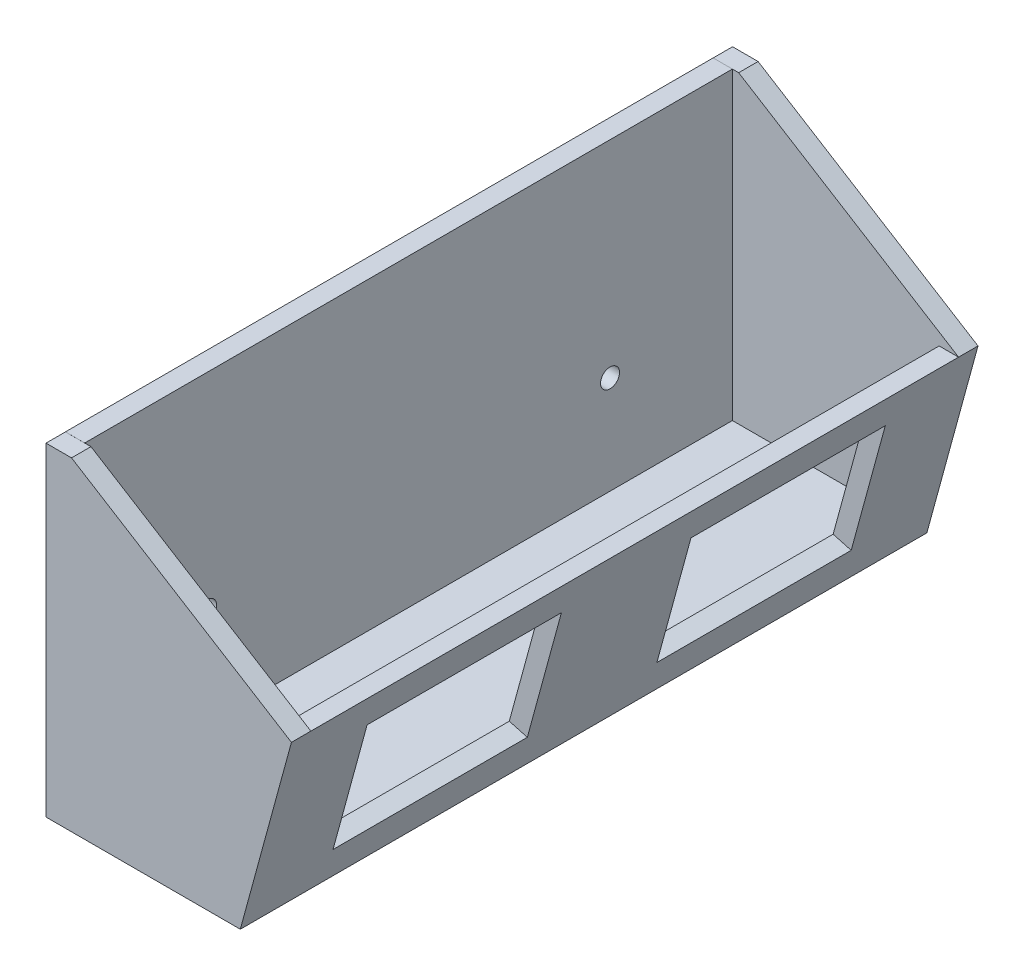
ISO-10303-21;
HEADER;
FILE_DESCRIPTION(('STEP AP214'),'2;1');
FILE_NAME('part.step','',(''),(''),'','','');
FILE_SCHEMA(('AUTOMOTIVE_DESIGN { 1 0 10303 214 1 1 1 1 }'));
ENDSEC;
DATA;
#1=APPLICATION_CONTEXT('core data for automotive mechanical design processes');
#2=APPLICATION_PROTOCOL_DEFINITION('international standard','automotive_design',2000,#1);
#3=PRODUCT_CONTEXT('',#1,'mechanical');
#4=PRODUCT('Part','Part','',(#3));
#5=PRODUCT_RELATED_PRODUCT_CATEGORY('part','',(#4));
#6=PRODUCT_DEFINITION_FORMATION('','',#4);
#7=PRODUCT_DEFINITION_CONTEXT('part definition',#1,'design');
#8=PRODUCT_DEFINITION('design','',#6,#7);
#9=PRODUCT_DEFINITION_SHAPE('','',#8);
#10=(LENGTH_UNIT() NAMED_UNIT(*) SI_UNIT(.MILLI.,.METRE.));
#11=(NAMED_UNIT(*) PLANE_ANGLE_UNIT() SI_UNIT($,.RADIAN.));
#12=(NAMED_UNIT(*) SI_UNIT($,.STERADIAN.) SOLID_ANGLE_UNIT());
#13=UNCERTAINTY_MEASURE_WITH_UNIT(LENGTH_MEASURE(1.E-05),#10,'distance_accuracy_value','');
#14=(GEOMETRIC_REPRESENTATION_CONTEXT(3) GLOBAL_UNCERTAINTY_ASSIGNED_CONTEXT((#13)) GLOBAL_UNIT_ASSIGNED_CONTEXT((#10,
#11,#12)) REPRESENTATION_CONTEXT('',''));
#15=CARTESIAN_POINT('',(0.,0.,0.));
#16=DIRECTION('',(0.,0.,1.));
#17=DIRECTION('',(1.,0.,0.));
#18=AXIS2_PLACEMENT_3D('',#15,#16,#17);
#19=CARTESIAN_POINT('',(37.8942985604375,28.9427028841239,3.));
#20=DIRECTION('',(-0.964756762804131,0.263143285347916,0.));
#21=DIRECTION('',(-0.263143285347916,-0.964756762804131,0.));
#22=AXIS2_PLACEMENT_3D('',#19,#20,#21);
#23=PLANE('',#22);
#24=DIRECTION('',(0.,0.,-1.));
#25=VECTOR('',#24,1.);
#26=CARTESIAN_POINT('',(37.8942985604375,28.9427028841239,3.));
#27=LINE('',#26,#25);
#28=CARTESIAN_POINT('',(37.8942985604375,28.9427028841239,103.));
#29=VERTEX_POINT('',#28);
#30=CARTESIAN_POINT('',(37.8942985604375,28.9427028841239,3.));
#31=VERTEX_POINT('',#30);
#32=EDGE_CURVE('E256',#29,#31,#27,.T.);
#33=ORIENTED_EDGE('',*,*,#32,.F.);
#34=DIRECTION('',(0.,0.,-1.));
#35=VECTOR('',#34,1.);
#36=CARTESIAN_POINT('',(37.8942985604375,28.9427028841239,106.));
#37=LINE('',#36,#35);
#38=CARTESIAN_POINT('',(37.8942985604375,28.9427028841239,106.));
#39=VERTEX_POINT('',#38);
#40=EDGE_CURVE('E311',#39,#29,#37,.T.);
#41=ORIENTED_EDGE('',*,*,#40,.F.);
#42=DIRECTION('',(0.263143285347916,0.964756762804131,0.));
#43=VECTOR('',#42,1.);
#44=CARTESIAN_POINT('',(37.8942985604375,28.9427028841239,106.));
#45=LINE('',#44,#43);
#46=CARTESIAN_POINT('',(30.,0.,106.));
#47=VERTEX_POINT('',#46);
#48=EDGE_CURVE('E291',#47,#39,#45,.T.);
#49=ORIENTED_EDGE('',*,*,#48,.F.);
#50=DIRECTION('',(0.,0.,-1.));
#51=VECTOR('',#50,1.);
#52=CARTESIAN_POINT('',(30.,0.,3.));
#53=LINE('',#52,#51);
#54=CARTESIAN_POINT('',(30.,0.,0.));
#55=VERTEX_POINT('',#54);
#56=EDGE_CURVE('E41',#47,#55,#53,.T.);
#57=ORIENTED_EDGE('',*,*,#56,.T.);
#58=DIRECTION('',(0.263143285347916,0.964756762804131,0.));
#59=VECTOR('',#58,1.);
#60=CARTESIAN_POINT('',(37.8942985604375,28.9427028841239,0.));
#61=LINE('',#60,#59);
#62=CARTESIAN_POINT('',(37.8942985604375,28.9427028841239,0.));
#63=VERTEX_POINT('',#62);
#64=EDGE_CURVE('E327',#55,#63,#61,.T.);
#65=ORIENTED_EDGE('',*,*,#64,.T.);
#66=DIRECTION('',(0.,0.,-1.));
#67=VECTOR('',#66,1.);
#68=CARTESIAN_POINT('',(37.8942985604375,28.9427028841239,3.));
#69=LINE('',#68,#67);
#70=EDGE_CURVE('E342',#31,#63,#69,.T.);
#71=ORIENTED_EDGE('',*,*,#70,.F.);
#72=EDGE_LOOP('',(#33,#41,#49,#57,#65,#71));
#73=FACE_BOUND('',#72,.T.);
#74=DIRECTION('',(0.263143285347916,0.964756762804131,0.));
#75=VECTOR('',#74,1.);
#76=CARTESIAN_POINT('',(36.5785821336979,24.1189190701033,63.));
#77=LINE('',#76,#75);
#78=CARTESIAN_POINT('',(31.3157164267396,4.82378381402067,63.));
#79=VERTEX_POINT('',#78);
#80=CARTESIAN_POINT('',(36.5785821336979,24.1189190701033,63.));
#81=VERTEX_POINT('',#80);
#82=EDGE_CURVE('E217',#79,#81,#77,.T.);
#83=ORIENTED_EDGE('',*,*,#82,.F.);
#84=DIRECTION('',(0.,0.,-1.));
#85=VECTOR('',#84,1.);
#86=CARTESIAN_POINT('',(31.3157164267396,4.82378381402066,93.));
#87=LINE('',#86,#85);
#88=CARTESIAN_POINT('',(31.3157164267396,4.82378381402066,93.));
#89=VERTEX_POINT('',#88);
#90=EDGE_CURVE('E220',#89,#79,#87,.T.);
#91=ORIENTED_EDGE('',*,*,#90,.F.);
#92=DIRECTION('',(-0.263143285347916,-0.96475676280413,0.));
#93=VECTOR('',#92,1.);
#94=CARTESIAN_POINT('',(36.5785821336979,24.1189190701033,93.));
#95=LINE('',#94,#93);
#96=CARTESIAN_POINT('',(36.5785821336979,24.1189190701033,93.));
#97=VERTEX_POINT('',#96);
#98=EDGE_CURVE('E210',#97,#89,#95,.T.);
#99=ORIENTED_EDGE('',*,*,#98,.F.);
#100=DIRECTION('',(0.,0.,1.));
#101=VECTOR('',#100,1.);
#102=CARTESIAN_POINT('',(36.5785821336979,24.1189190701033,93.));
#103=LINE('',#102,#101);
#104=EDGE_CURVE('E215',#81,#97,#103,.T.);
#105=ORIENTED_EDGE('',*,*,#104,.F.);
#106=EDGE_LOOP('',(#83,#91,#99,#105));
#107=FACE_BOUND('',#106,.T.);
#108=DIRECTION('',(0.,0.,-1.));
#109=VECTOR('',#108,1.);
#110=CARTESIAN_POINT('',(36.5785821336979,24.1189190701033,13.));
#111=LINE('',#110,#109);
#112=CARTESIAN_POINT('',(36.5785821336979,24.1189190701033,43.));
#113=VERTEX_POINT('',#112);
#114=CARTESIAN_POINT('',(36.5785821336979,24.1189190701033,13.));
#115=VERTEX_POINT('',#114);
#116=EDGE_CURVE('E184',#113,#115,#111,.T.);
#117=ORIENTED_EDGE('',*,*,#116,.T.);
#118=DIRECTION('',(-0.263143285347916,-0.96475676280413,0.));
#119=VECTOR('',#118,1.);
#120=CARTESIAN_POINT('',(36.5785821336979,24.1189190701033,13.));
#121=LINE('',#120,#119);
#122=CARTESIAN_POINT('',(31.3157164267396,4.8237838140207,13.));
#123=VERTEX_POINT('',#122);
#124=EDGE_CURVE('E192',#115,#123,#121,.T.);
#125=ORIENTED_EDGE('',*,*,#124,.T.);
#126=DIRECTION('',(0.,0.,1.));
#127=VECTOR('',#126,1.);
#128=CARTESIAN_POINT('',(31.3157164267396,4.8237838140207,13.));
#129=LINE('',#128,#127);
#130=CARTESIAN_POINT('',(31.3157164267396,4.82378381402068,43.));
#131=VERTEX_POINT('',#130);
#132=EDGE_CURVE('E48',#123,#131,#129,.T.);
#133=ORIENTED_EDGE('',*,*,#132,.T.);
#134=DIRECTION('',(0.263143285347916,0.964756762804131,0.));
#135=VECTOR('',#134,1.);
#136=CARTESIAN_POINT('',(36.5785821336979,24.1189190701033,43.));
#137=LINE('',#136,#135);
#138=EDGE_CURVE('E199',#131,#113,#137,.T.);
#139=ORIENTED_EDGE('',*,*,#138,.T.);
#140=EDGE_LOOP('',(#117,#125,#133,#139));
#141=FACE_BOUND('',#140,.T.);
#142=ADVANCED_FACE('F33',(#73,#107,#141),#23,.F.);
#143=CARTESIAN_POINT('',(27.8242856541056,3.0061175714593,3.));
#144=DIRECTION('',(-0.964756762804131,0.263143285347916,0.));
#145=DIRECTION('',(-0.263143285347916,-0.964756762804131,0.));
#146=AXIS2_PLACEMENT_3D('',#143,#144,#145);
#147=PLANE('',#146);
#148=DIRECTION('',(0.,0.,-1.));
#149=VECTOR('',#148,1.);
#150=CARTESIAN_POINT('',(28.5274972348041,5.58428758732769,93.));
#151=LINE('',#150,#149);
#152=CARTESIAN_POINT('',(28.5274972348041,5.5842875873277,93.));
#153=VERTEX_POINT('',#152);
#154=CARTESIAN_POINT('',(28.5274972348041,5.5842875873277,63.));
#155=VERTEX_POINT('',#154);
#156=EDGE_CURVE('E211',#153,#155,#151,.T.);
#157=ORIENTED_EDGE('',*,*,#156,.T.);
#158=DIRECTION('',(0.263143285347916,0.964756762804131,0.));
#159=VECTOR('',#158,1.);
#160=CARTESIAN_POINT('',(33.7903629417624,24.8794228434103,63.));
#161=LINE('',#160,#159);
#162=CARTESIAN_POINT('',(33.7903629417624,24.8794228434103,63.));
#163=VERTEX_POINT('',#162);
#164=EDGE_CURVE('E234',#155,#163,#161,.T.);
#165=ORIENTED_EDGE('',*,*,#164,.T.);
#166=DIRECTION('',(0.,0.,1.));
#167=VECTOR('',#166,1.);
#168=CARTESIAN_POINT('',(33.7903629417624,24.8794228434103,93.));
#169=LINE('',#168,#167);
#170=CARTESIAN_POINT('',(33.7903629417624,24.8794228434103,93.));
#171=VERTEX_POINT('',#170);
#172=EDGE_CURVE('E230',#163,#171,#169,.T.);
#173=ORIENTED_EDGE('',*,*,#172,.T.);
#174=DIRECTION('',(-0.263143285347916,-0.964756762804131,0.));
#175=VECTOR('',#174,1.);
#176=CARTESIAN_POINT('',(33.7903629417624,24.8794228434103,93.));
#177=LINE('',#176,#175);
#178=EDGE_CURVE('E225',#171,#153,#177,.T.);
#179=ORIENTED_EDGE('',*,*,#178,.T.);
#180=EDGE_LOOP('',(#157,#165,#173,#179));
#181=FACE_BOUND('',#180,.T.);
#182=DIRECTION('',(0.263143285347916,0.964756762804131,0.));
#183=VECTOR('',#182,1.);
#184=CARTESIAN_POINT('',(27.8242856541056,3.0061175714593,103.));
#185=LINE('',#184,#183);
#186=CARTESIAN_POINT('',(27.8242856541056,3.0061175714593,103.));
#187=VERTEX_POINT('',#186);
#188=CARTESIAN_POINT('',(34.8986473305592,28.9427028841239,103.));
#189=VERTEX_POINT('',#188);
#190=EDGE_CURVE('E249',#187,#189,#185,.T.);
#191=ORIENTED_EDGE('',*,*,#190,.T.);
#192=DIRECTION('',(0.,0.,1.));
#193=VECTOR('',#192,1.);
#194=CARTESIAN_POINT('',(34.8986473305592,28.9427028841239,3.));
#195=LINE('',#194,#193);
#196=CARTESIAN_POINT('',(34.8986473305592,28.9427028841239,3.));
#197=VERTEX_POINT('',#196);
#198=EDGE_CURVE('E246',#197,#189,#195,.T.);
#199=ORIENTED_EDGE('',*,*,#198,.F.);
#200=DIRECTION('',(0.263143285347916,0.964756762804131,0.));
#201=VECTOR('',#200,1.);
#202=CARTESIAN_POINT('',(27.8242856541056,3.0061175714593,3.));
#203=LINE('',#202,#201);
#204=CARTESIAN_POINT('',(27.8242856541055,3.0061175714593,3.));
#205=VERTEX_POINT('',#204);
#206=EDGE_CURVE('E245',#205,#197,#203,.T.);
#207=ORIENTED_EDGE('',*,*,#206,.F.);
#208=DIRECTION('',(0.,0.,1.));
#209=VECTOR('',#208,1.);
#210=CARTESIAN_POINT('',(27.8242856541056,3.0061175714593,3.));
#211=LINE('',#210,#209);
#212=EDGE_CURVE('E242',#205,#187,#211,.T.);
#213=ORIENTED_EDGE('',*,*,#212,.T.);
#214=EDGE_LOOP('',(#191,#199,#207,#213));
#215=FACE_BOUND('',#214,.T.);
#216=DIRECTION('',(-0.263143285347916,-0.964756762804131,0.));
#217=VECTOR('',#216,1.);
#218=CARTESIAN_POINT('',(33.7903629417624,24.8794228434103,13.));
#219=LINE('',#218,#217);
#220=CARTESIAN_POINT('',(33.7903629417624,24.8794228434103,13.));
#221=VERTEX_POINT('',#220);
#222=CARTESIAN_POINT('',(28.5274972348041,5.58428758732773,13.));
#223=VERTEX_POINT('',#222);
#224=EDGE_CURVE('E196',#221,#223,#219,.T.);
#225=ORIENTED_EDGE('',*,*,#224,.F.);
#226=DIRECTION('',(0.,0.,-1.));
#227=VECTOR('',#226,1.);
#228=CARTESIAN_POINT('',(33.7903629417624,24.8794228434103,13.));
#229=LINE('',#228,#227);
#230=CARTESIAN_POINT('',(33.7903629417624,24.8794228434103,43.));
#231=VERTEX_POINT('',#230);
#232=EDGE_CURVE('E56',#231,#221,#229,.T.);
#233=ORIENTED_EDGE('',*,*,#232,.F.);
#234=DIRECTION('',(0.263143285347916,0.964756762804131,0.));
#235=VECTOR('',#234,1.);
#236=CARTESIAN_POINT('',(33.7903629417624,24.8794228434103,43.));
#237=LINE('',#236,#235);
#238=CARTESIAN_POINT('',(28.5274972348041,5.58428758732771,43.));
#239=VERTEX_POINT('',#238);
#240=EDGE_CURVE('E419',#239,#231,#237,.T.);
#241=ORIENTED_EDGE('',*,*,#240,.F.);
#242=DIRECTION('',(0.,0.,1.));
#243=VECTOR('',#242,1.);
#244=CARTESIAN_POINT('',(28.5274972348041,5.58428758732773,13.));
#245=LINE('',#244,#243);
#246=EDGE_CURVE('E418',#223,#239,#245,.T.);
#247=ORIENTED_EDGE('',*,*,#246,.F.);
#248=EDGE_LOOP('',(#225,#233,#241,#247));
#249=FACE_BOUND('',#248,.T.);
#250=ADVANCED_FACE('F410',(#181,#215,#249),#147,.T.);
#251=CARTESIAN_POINT('',(0.,0.,3.));
#252=DIRECTION('',(0.,0.,-1.));
#253=DIRECTION('',(-1.,0.,0.));
#254=AXIS2_PLACEMENT_3D('',#251,#252,#253);
#255=PLANE('',#254);
#256=DIRECTION('',(-1.,0.,0.));
#257=VECTOR('',#256,1.);
#258=CARTESIAN_POINT('',(37.8942985604375,28.9427028841239,3.));
#259=LINE('',#258,#257);
#260=EDGE_CURVE('E259',#31,#197,#259,.T.);
#261=ORIENTED_EDGE('',*,*,#260,.F.);
#262=DIRECTION('',(-0.849820074148082,0.527072899677974,0.));
#263=VECTOR('',#262,1.);
#264=CARTESIAN_POINT('',(3.94280189402707,50.,3.));
#265=LINE('',#264,#263);
#266=CARTESIAN_POINT('',(3.94280189402707,50.,3.));
#267=VERTEX_POINT('',#266);
#268=EDGE_CURVE('E318',#31,#267,#265,.T.);
#269=ORIENTED_EDGE('',*,*,#268,.T.);
#270=DIRECTION('',(-1.,0.,0.));
#271=VECTOR('',#270,1.);
#272=CARTESIAN_POINT('',(0.,50.,3.));
#273=LINE('',#272,#271);
#274=CARTESIAN_POINT('',(2.97567344961181,50.,3.));
#275=VERTEX_POINT('',#274);
#276=EDGE_CURVE('E320',#267,#275,#273,.T.);
#277=ORIENTED_EDGE('',*,*,#276,.T.);
#278=DIRECTION('',(0.,-1.,0.));
#279=VECTOR('',#278,1.);
#280=CARTESIAN_POINT('',(2.97567344961181,50.0061175714593,3.));
#281=LINE('',#280,#279);
#282=CARTESIAN_POINT('',(2.97567344961181,3.0061175714593,3.));
#283=VERTEX_POINT('',#282);
#284=EDGE_CURVE('E277',#275,#283,#281,.T.);
#285=ORIENTED_EDGE('',*,*,#284,.T.);
#286=DIRECTION('',(-1.,0.,0.));
#287=VECTOR('',#286,1.);
#288=CARTESIAN_POINT('',(0.,3.0061175714593,3.));
#289=LINE('',#288,#287);
#290=EDGE_CURVE('E313',#205,#283,#289,.T.);
#291=ORIENTED_EDGE('',*,*,#290,.F.);
#292=ORIENTED_EDGE('',*,*,#206,.T.);
#293=EDGE_LOOP('',(#261,#269,#277,#285,#291,#292));
#294=FACE_BOUND('',#293,.T.);
#295=ADVANCED_FACE('F370',(#294),#255,.F.);
#296=CARTESIAN_POINT('',(0.,3.0061175714593,103.));
#297=DIRECTION('',(0.,-1.,0.));
#298=DIRECTION('',(0.,0.,-1.));
#299=AXIS2_PLACEMENT_3D('',#296,#297,#298);
#300=PLANE('',#299);
#301=ORIENTED_EDGE('',*,*,#212,.F.);
#302=ORIENTED_EDGE('',*,*,#290,.T.);
#303=DIRECTION('',(0.,0.,-1.));
#304=VECTOR('',#303,1.);
#305=CARTESIAN_POINT('',(2.97567344961181,3.0061175714593,3.));
#306=LINE('',#305,#304);
#307=CARTESIAN_POINT('',(2.97567344961181,3.0061175714593,103.));
#308=VERTEX_POINT('',#307);
#309=EDGE_CURVE('E262',#308,#283,#306,.T.);
#310=ORIENTED_EDGE('',*,*,#309,.F.);
#311=DIRECTION('',(-1.,0.,0.));
#312=VECTOR('',#311,1.);
#313=CARTESIAN_POINT('',(0.,3.0061175714593,103.));
#314=LINE('',#313,#312);
#315=EDGE_CURVE('E314',#187,#308,#314,.T.);
#316=ORIENTED_EDGE('',*,*,#315,.F.);
#317=EDGE_LOOP('',(#301,#302,#310,#316));
#318=FACE_BOUND('',#317,.T.);
#319=ADVANCED_FACE('F407',(#318),#300,.F.);
#320=CARTESIAN_POINT('',(0.,0.,103.));
#321=DIRECTION('',(0.,0.,-1.));
#322=DIRECTION('',(-1.,0.,0.));
#323=AXIS2_PLACEMENT_3D('',#320,#321,#322);
#324=PLANE('',#323);
#325=DIRECTION('',(1.,0.,0.));
#326=VECTOR('',#325,1.);
#327=CARTESIAN_POINT('',(37.8942985604375,28.9427028841239,103.));
#328=LINE('',#327,#326);
#329=EDGE_CURVE('E252',#189,#29,#328,.T.);
#330=ORIENTED_EDGE('',*,*,#329,.F.);
#331=ORIENTED_EDGE('',*,*,#190,.F.);
#332=ORIENTED_EDGE('',*,*,#315,.T.);
#333=DIRECTION('',(0.,1.,0.));
#334=VECTOR('',#333,1.);
#335=CARTESIAN_POINT('',(2.97567344961181,0.,103.));
#336=LINE('',#335,#334);
#337=CARTESIAN_POINT('',(2.97567344961181,50.,103.));
#338=VERTEX_POINT('',#337);
#339=EDGE_CURVE('E11',#308,#338,#336,.T.);
#340=ORIENTED_EDGE('',*,*,#339,.T.);
#341=DIRECTION('',(-1.,0.,0.));
#342=VECTOR('',#341,1.);
#343=CARTESIAN_POINT('',(0.,50.,103.));
#344=LINE('',#343,#342);
#345=CARTESIAN_POINT('',(3.94280189402707,50.,103.));
#346=VERTEX_POINT('',#345);
#347=EDGE_CURVE('E292',#346,#338,#344,.T.);
#348=ORIENTED_EDGE('',*,*,#347,.F.);
#349=DIRECTION('',(-0.849820074148082,0.527072899677974,0.));
#350=VECTOR('',#349,1.);
#351=CARTESIAN_POINT('',(3.94280189402707,50.,103.));
#352=LINE('',#351,#350);
#353=EDGE_CURVE('E287',#29,#346,#352,.T.);
#354=ORIENTED_EDGE('',*,*,#353,.F.);
#355=EDGE_LOOP('',(#330,#331,#332,#340,#348,#354));
#356=FACE_BOUND('',#355,.T.);
#357=ADVANCED_FACE('F378',(#356),#324,.T.);
#358=CARTESIAN_POINT('',(30.,0.,3.));
#359=DIRECTION('',(0.,1.,0.));
#360=DIRECTION('',(-1.,0.,0.));
#361=AXIS2_PLACEMENT_3D('',#358,#359,#360);
#362=PLANE('',#361);
#363=DIRECTION('',(1.,0.,0.));
#364=VECTOR('',#363,1.);
#365=CARTESIAN_POINT('',(30.,0.,0.));
#366=LINE('',#365,#364);
#367=CARTESIAN_POINT('',(0.,0.,0.));
#368=VERTEX_POINT('',#367);
#369=EDGE_CURVE('E316',#368,#55,#366,.T.);
#370=ORIENTED_EDGE('',*,*,#369,.T.);
#371=ORIENTED_EDGE('',*,*,#56,.F.);
#372=DIRECTION('',(1.,0.,0.));
#373=VECTOR('',#372,1.);
#374=CARTESIAN_POINT('',(30.,0.,106.));
#375=LINE('',#374,#373);
#376=CARTESIAN_POINT('',(0.,0.,106.));
#377=VERTEX_POINT('',#376);
#378=EDGE_CURVE('E288',#377,#47,#375,.T.);
#379=ORIENTED_EDGE('',*,*,#378,.F.);
#380=DIRECTION('',(0.,0.,-1.));
#381=VECTOR('',#380,1.);
#382=CARTESIAN_POINT('',(0.,0.,3.));
#383=LINE('',#382,#381);
#384=EDGE_CURVE('E324',#377,#368,#383,.T.);
#385=ORIENTED_EDGE('',*,*,#384,.T.);
#386=EDGE_LOOP('',(#370,#371,#379,#385));
#387=FACE_BOUND('',#386,.T.);
#388=ADVANCED_FACE('F35',(#387),#362,.F.);
#389=CARTESIAN_POINT('',(3.94280189402707,50.,3.));
#390=DIRECTION('',(-0.527072899677974,-0.849820074148082,0.));
#391=DIRECTION('',(0.849820074148082,-0.527072899677974,0.));
#392=AXIS2_PLACEMENT_3D('',#389,#390,#391);
#393=PLANE('',#392);
#394=DIRECTION('',(-0.849820074148082,0.527072899677974,0.));
#395=VECTOR('',#394,1.);
#396=CARTESIAN_POINT('',(3.94280189402707,50.,0.));
#397=LINE('',#396,#395);
#398=CARTESIAN_POINT('',(3.94280189402707,50.,0.));
#399=VERTEX_POINT('',#398);
#400=EDGE_CURVE('E329',#63,#399,#397,.T.);
#401=ORIENTED_EDGE('',*,*,#400,.T.);
#402=DIRECTION('',(0.,0.,-1.));
#403=VECTOR('',#402,1.);
#404=CARTESIAN_POINT('',(3.94280189402707,50.,3.));
#405=LINE('',#404,#403);
#406=EDGE_CURVE('E339',#267,#399,#405,.T.);
#407=ORIENTED_EDGE('',*,*,#406,.F.);
#408=ORIENTED_EDGE('',*,*,#268,.F.);
#409=ORIENTED_EDGE('',*,*,#70,.T.);
#410=EDGE_LOOP('',(#401,#407,#408,#409));
#411=FACE_BOUND('',#410,.T.);
#412=ADVANCED_FACE('F361',(#411),#393,.F.);
#413=CARTESIAN_POINT('',(0.,50.,3.));
#414=DIRECTION('',(0.,-1.,0.));
#415=DIRECTION('',(0.,0.,-1.));
#416=AXIS2_PLACEMENT_3D('',#413,#414,#415);
#417=PLANE('',#416);
#418=DIRECTION('',(-1.,0.,0.));
#419=VECTOR('',#418,1.);
#420=CARTESIAN_POINT('',(0.,50.,0.));
#421=LINE('',#420,#419);
#422=CARTESIAN_POINT('',(0.,50.,0.));
#423=VERTEX_POINT('',#422);
#424=EDGE_CURVE('E331',#399,#423,#421,.T.);
#425=ORIENTED_EDGE('',*,*,#424,.T.);
#426=DIRECTION('',(0.,0.,-1.));
#427=VECTOR('',#426,1.);
#428=CARTESIAN_POINT('',(0.,50.,3.));
#429=LINE('',#428,#427);
#430=CARTESIAN_POINT('',(0.,50.,3.));
#431=VERTEX_POINT('',#430);
#432=EDGE_CURVE('E336',#431,#423,#429,.T.);
#433=ORIENTED_EDGE('',*,*,#432,.F.);
#434=DIRECTION('',(-1.,0.,0.));
#435=VECTOR('',#434,1.);
#436=CARTESIAN_POINT('',(0.,50.,3.));
#437=LINE('',#436,#435);
#438=EDGE_CURVE('E285',#275,#431,#437,.T.);
#439=ORIENTED_EDGE('',*,*,#438,.F.);
#440=ORIENTED_EDGE('',*,*,#276,.F.);
#441=ORIENTED_EDGE('',*,*,#406,.T.);
#442=EDGE_LOOP('',(#425,#433,#439,#440,#441));
#443=FACE_BOUND('',#442,.T.);
#444=ADVANCED_FACE('F364',(#443),#417,.F.);
#445=CARTESIAN_POINT('',(0.,0.,3.));
#446=DIRECTION('',(1.,0.,0.));
#447=DIRECTION('',(0.,0.,-1.));
#448=AXIS2_PLACEMENT_3D('',#445,#446,#447);
#449=PLANE('',#448);
#450=CARTESIAN_POINT('',(0.,18.1575227187052,21.8920936392763));
#451=DIRECTION('',(1.,0.,0.));
#452=DIRECTION('',(0.,0.,-1.));
#453=AXIS2_PLACEMENT_3D('',#450,#451,#452);
#454=CIRCLE('',#453,1.46214160124625);
#455=CARTESIAN_POINT('',(0.,18.1575227187052,20.42995203803));
#456=VERTEX_POINT('',#455);
#457=EDGE_CURVE('E430',#456,#456,#454,.F.);
#458=ORIENTED_EDGE('',*,*,#457,.F.);
#459=EDGE_LOOP('',(#458));
#460=FACE_BOUND('',#459,.T.);
#461=CARTESIAN_POINT('',(0.,18.1575227187052,84.1079063607237));
#462=DIRECTION('',(1.,0.,0.));
#463=DIRECTION('',(0.,0.,-1.));
#464=AXIS2_PLACEMENT_3D('',#461,#462,#463);
#465=CIRCLE('',#464,1.46214160124625);
#466=CARTESIAN_POINT('',(0.,18.1575227187052,82.6457647594775));
#467=VERTEX_POINT('',#466);
#468=EDGE_CURVE('E424',#467,#467,#465,.T.);
#469=ORIENTED_EDGE('',*,*,#468,.T.);
#470=EDGE_LOOP('',(#469));
#471=FACE_BOUND('',#470,.T.);
#472=DIRECTION('',(0.,-1.,0.));
#473=VECTOR('',#472,1.);
#474=CARTESIAN_POINT('',(0.,50.0061175714593,3.));
#475=LINE('',#474,#473);
#476=CARTESIAN_POINT('',(0.,50.0061175714593,3.));
#477=VERTEX_POINT('',#476);
#478=EDGE_CURVE('E272',#477,#431,#475,.T.);
#479=ORIENTED_EDGE('',*,*,#478,.T.);
#480=ORIENTED_EDGE('',*,*,#432,.T.);
#481=DIRECTION('',(0.,-1.,0.));
#482=VECTOR('',#481,1.);
#483=CARTESIAN_POINT('',(0.,0.,0.));
#484=LINE('',#483,#482);
#485=EDGE_CURVE('E321',#423,#368,#484,.T.);
#486=ORIENTED_EDGE('',*,*,#485,.T.);
#487=ORIENTED_EDGE('',*,*,#384,.F.);
#488=DIRECTION('',(0.,-1.,0.));
#489=VECTOR('',#488,1.);
#490=CARTESIAN_POINT('',(0.,0.,106.));
#491=LINE('',#490,#489);
#492=CARTESIAN_POINT('',(0.,50.,106.));
#493=VERTEX_POINT('',#492);
#494=EDGE_CURVE('E298',#493,#377,#491,.T.);
#495=ORIENTED_EDGE('',*,*,#494,.F.);
#496=DIRECTION('',(0.,0.,-1.));
#497=VECTOR('',#496,1.);
#498=CARTESIAN_POINT('',(0.,50.,106.));
#499=LINE('',#498,#497);
#500=CARTESIAN_POINT('',(0.,50.,103.));
#501=VERTEX_POINT('',#500);
#502=EDGE_CURVE('E301',#493,#501,#499,.T.);
#503=ORIENTED_EDGE('',*,*,#502,.T.);
#504=DIRECTION('',(0.,-1.,0.));
#505=VECTOR('',#504,1.);
#506=CARTESIAN_POINT('',(0.,50.0061175714593,103.));
#507=LINE('',#506,#505);
#508=CARTESIAN_POINT('',(0.,50.0061175714593,103.));
#509=VERTEX_POINT('',#508);
#510=EDGE_CURVE('E283',#509,#501,#507,.T.);
#511=ORIENTED_EDGE('',*,*,#510,.F.);
#512=DIRECTION('',(0.,0.,1.));
#513=VECTOR('',#512,1.);
#514=CARTESIAN_POINT('',(0.,50.0061175714593,3.));
#515=LINE('',#514,#513);
#516=EDGE_CURVE('E263',#477,#509,#515,.T.);
#517=ORIENTED_EDGE('',*,*,#516,.F.);
#518=EDGE_LOOP('',(#479,#480,#486,#487,#495,#503,#511,#517));
#519=FACE_BOUND('',#518,.T.);
#520=ADVANCED_FACE('F393',(#460,#471,#519),#449,.F.);
#521=CARTESIAN_POINT('',(0.,0.,0.));
#522=DIRECTION('',(0.,0.,-1.));
#523=DIRECTION('',(-1.,0.,0.));
#524=AXIS2_PLACEMENT_3D('',#521,#522,#523);
#525=PLANE('',#524);
#526=ORIENTED_EDGE('',*,*,#369,.F.);
#527=ORIENTED_EDGE('',*,*,#485,.F.);
#528=ORIENTED_EDGE('',*,*,#424,.F.);
#529=ORIENTED_EDGE('',*,*,#400,.F.);
#530=ORIENTED_EDGE('',*,*,#64,.F.);
#531=EDGE_LOOP('',(#526,#527,#528,#529,#530));
#532=FACE_BOUND('',#531,.T.);
#533=ADVANCED_FACE('F356',(#532),#525,.T.);
#534=CARTESIAN_POINT('',(3.94280189402707,50.,106.));
#535=DIRECTION('',(-0.527072899677974,-0.849820074148082,0.));
#536=DIRECTION('',(0.849820074148082,-0.527072899677974,0.));
#537=AXIS2_PLACEMENT_3D('',#534,#535,#536);
#538=PLANE('',#537);
#539=ORIENTED_EDGE('',*,*,#353,.T.);
#540=DIRECTION('',(0.,0.,-1.));
#541=VECTOR('',#540,1.);
#542=CARTESIAN_POINT('',(3.94280189402707,50.,106.));
#543=LINE('',#542,#541);
#544=CARTESIAN_POINT('',(3.94280189402707,50.,106.));
#545=VERTEX_POINT('',#544);
#546=EDGE_CURVE('E308',#545,#346,#543,.T.);
#547=ORIENTED_EDGE('',*,*,#546,.F.);
#548=DIRECTION('',(-0.849820074148082,0.527072899677974,0.));
#549=VECTOR('',#548,1.);
#550=CARTESIAN_POINT('',(3.94280189402707,50.,106.));
#551=LINE('',#550,#549);
#552=EDGE_CURVE('E294',#39,#545,#551,.T.);
#553=ORIENTED_EDGE('',*,*,#552,.F.);
#554=ORIENTED_EDGE('',*,*,#40,.T.);
#555=EDGE_LOOP('',(#539,#547,#553,#554));
#556=FACE_BOUND('',#555,.T.);
#557=ADVANCED_FACE('F383',(#556),#538,.F.);
#558=CARTESIAN_POINT('',(0.,50.,106.));
#559=DIRECTION('',(0.,-1.,0.));
#560=DIRECTION('',(0.,0.,-1.));
#561=AXIS2_PLACEMENT_3D('',#558,#559,#560);
#562=PLANE('',#561);
#563=ORIENTED_EDGE('',*,*,#347,.T.);
#564=EDGE_CURVE('E303',#338,#501,#344,.T.);
#565=ORIENTED_EDGE('',*,*,#564,.T.);
#566=ORIENTED_EDGE('',*,*,#502,.F.);
#567=DIRECTION('',(-1.,0.,0.));
#568=VECTOR('',#567,1.);
#569=CARTESIAN_POINT('',(0.,50.,106.));
#570=LINE('',#569,#568);
#571=EDGE_CURVE('E296',#545,#493,#570,.T.);
#572=ORIENTED_EDGE('',*,*,#571,.F.);
#573=ORIENTED_EDGE('',*,*,#546,.T.);
#574=EDGE_LOOP('',(#563,#565,#566,#572,#573));
#575=FACE_BOUND('',#574,.T.);
#576=ADVANCED_FACE('F386',(#575),#562,.F.);
#577=CARTESIAN_POINT('',(0.,0.,106.));
#578=DIRECTION('',(0.,0.,-1.));
#579=DIRECTION('',(-1.,0.,0.));
#580=AXIS2_PLACEMENT_3D('',#577,#578,#579);
#581=PLANE('',#580);
#582=ORIENTED_EDGE('',*,*,#378,.T.);
#583=ORIENTED_EDGE('',*,*,#48,.T.);
#584=ORIENTED_EDGE('',*,*,#552,.T.);
#585=ORIENTED_EDGE('',*,*,#571,.T.);
#586=ORIENTED_EDGE('',*,*,#494,.T.);
#587=EDGE_LOOP('',(#582,#583,#584,#585,#586));
#588=FACE_BOUND('',#587,.T.);
#589=ADVANCED_FACE('F391',(#588),#581,.F.);
#590=CARTESIAN_POINT('',(0.,50.0061175714593,3.));
#591=DIRECTION('',(0.,0.,1.));
#592=DIRECTION('',(1.,0.,0.));
#593=AXIS2_PLACEMENT_3D('',#590,#591,#592);
#594=PLANE('',#593);
#595=CARTESIAN_POINT('',(2.97567344961181,50.0061175714593,3.));
#596=VERTEX_POINT('',#595);
#597=EDGE_CURVE('E278',#596,#275,#281,.T.);
#598=ORIENTED_EDGE('',*,*,#597,.T.);
#599=ORIENTED_EDGE('',*,*,#438,.T.);
#600=ORIENTED_EDGE('',*,*,#478,.F.);
#601=DIRECTION('',(-1.,0.,0.));
#602=VECTOR('',#601,1.);
#603=CARTESIAN_POINT('',(0.,50.0061175714593,3.));
#604=LINE('',#603,#602);
#605=EDGE_CURVE('E270',#596,#477,#604,.T.);
#606=ORIENTED_EDGE('',*,*,#605,.F.);
#607=EDGE_LOOP('',(#598,#599,#600,#606));
#608=FACE_BOUND('',#607,.T.);
#609=ADVANCED_FACE('F399',(#608),#594,.F.);
#610=CARTESIAN_POINT('',(0.,50.0061175714593,103.));
#611=DIRECTION('',(0.,0.,-1.));
#612=DIRECTION('',(-1.,0.,0.));
#613=AXIS2_PLACEMENT_3D('',#610,#611,#612);
#614=PLANE('',#613);
#615=ORIENTED_EDGE('',*,*,#510,.T.);
#616=ORIENTED_EDGE('',*,*,#564,.F.);
#617=DIRECTION('',(0.,-1.,0.));
#618=VECTOR('',#617,1.);
#619=CARTESIAN_POINT('',(2.97567344961181,50.0061175714593,103.));
#620=LINE('',#619,#618);
#621=CARTESIAN_POINT('',(2.97567344961181,50.0061175714593,103.));
#622=VERTEX_POINT('',#621);
#623=EDGE_CURVE('E281',#622,#338,#620,.T.);
#624=ORIENTED_EDGE('',*,*,#623,.F.);
#625=DIRECTION('',(1.,0.,0.));
#626=VECTOR('',#625,1.);
#627=CARTESIAN_POINT('',(0.,50.0061175714593,103.));
#628=LINE('',#627,#626);
#629=EDGE_CURVE('E266',#509,#622,#628,.T.);
#630=ORIENTED_EDGE('',*,*,#629,.F.);
#631=EDGE_LOOP('',(#615,#616,#624,#630));
#632=FACE_BOUND('',#631,.T.);
#633=ADVANCED_FACE('F482',(#632),#614,.F.);
#634=CARTESIAN_POINT('',(2.97567344961181,50.0061175714593,3.));
#635=DIRECTION('',(-1.,0.,0.));
#636=DIRECTION('',(0.,0.,1.));
#637=AXIS2_PLACEMENT_3D('',#634,#635,#636);
#638=PLANE('',#637);
#639=CARTESIAN_POINT('',(2.97567344961181,18.1575227187052,21.8920936392763));
#640=DIRECTION('',(-1.,0.,0.));
#641=DIRECTION('',(0.,0.,1.));
#642=AXIS2_PLACEMENT_3D('',#639,#640,#641);
#643=CIRCLE('',#642,1.46214160124625);
#644=CARTESIAN_POINT('',(2.97567344961181,18.1575227187052,23.3542352405225));
#645=VERTEX_POINT('',#644);
#646=EDGE_CURVE('E433',#645,#645,#643,.T.);
#647=ORIENTED_EDGE('',*,*,#646,.T.);
#648=EDGE_LOOP('',(#647));
#649=FACE_BOUND('',#648,.T.);
#650=CARTESIAN_POINT('',(2.97567344961181,18.1575227187052,84.1079063607237));
#651=DIRECTION('',(1.,0.,0.));
#652=DIRECTION('',(0.,0.,-1.));
#653=AXIS2_PLACEMENT_3D('',#650,#651,#652);
#654=CIRCLE('',#653,1.46214160124625);
#655=CARTESIAN_POINT('',(2.97567344961181,18.1575227187052,82.6457647594775));
#656=VERTEX_POINT('',#655);
#657=EDGE_CURVE('E427',#656,#656,#654,.T.);
#658=ORIENTED_EDGE('',*,*,#657,.F.);
#659=EDGE_LOOP('',(#658));
#660=FACE_BOUND('',#659,.T.);
#661=ORIENTED_EDGE('',*,*,#309,.T.);
#662=ORIENTED_EDGE('',*,*,#284,.F.);
#663=ORIENTED_EDGE('',*,*,#597,.F.);
#664=DIRECTION('',(0.,0.,-1.));
#665=VECTOR('',#664,1.);
#666=CARTESIAN_POINT('',(2.97567344961181,50.0061175714593,3.));
#667=LINE('',#666,#665);
#668=EDGE_CURVE('E268',#622,#596,#667,.T.);
#669=ORIENTED_EDGE('',*,*,#668,.F.);
#670=ORIENTED_EDGE('',*,*,#623,.T.);
#671=ORIENTED_EDGE('',*,*,#339,.F.);
#672=EDGE_LOOP('',(#661,#662,#663,#669,#670,#671));
#673=FACE_BOUND('',#672,.T.);
#674=ADVANCED_FACE('F403',(#649,#660,#673),#638,.F.);
#675=CARTESIAN_POINT('',(0.,50.0061175714593,0.));
#676=DIRECTION('',(0.,1.,0.));
#677=DIRECTION('',(0.,0.,1.));
#678=AXIS2_PLACEMENT_3D('',#675,#676,#677);
#679=PLANE('',#678);
#680=ORIENTED_EDGE('',*,*,#516,.T.);
#681=ORIENTED_EDGE('',*,*,#629,.T.);
#682=ORIENTED_EDGE('',*,*,#668,.T.);
#683=ORIENTED_EDGE('',*,*,#605,.T.);
#684=EDGE_LOOP('',(#680,#681,#682,#683));
#685=FACE_BOUND('',#684,.T.);
#686=ADVANCED_FACE('F488',(#685),#679,.T.);
#687=CARTESIAN_POINT('',(7.07436167645369,28.9427028841239,0.));
#688=DIRECTION('',(0.,-1.,0.));
#689=DIRECTION('',(0.,0.,-1.));
#690=AXIS2_PLACEMENT_3D('',#687,#688,#689);
#691=PLANE('',#690);
#692=ORIENTED_EDGE('',*,*,#32,.T.);
#693=ORIENTED_EDGE('',*,*,#260,.T.);
#694=ORIENTED_EDGE('',*,*,#198,.T.);
#695=ORIENTED_EDGE('',*,*,#329,.T.);
#696=EDGE_LOOP('',(#692,#693,#694,#695));
#697=FACE_BOUND('',#696,.T.);
#698=ADVANCED_FACE('F374',(#697),#691,.F.);
#699=CARTESIAN_POINT('',(-9.30315280908465,15.9028278901307,93.));
#700=DIRECTION('',(-0.263143285347916,-0.96475676280413,0.));
#701=DIRECTION('',(0.964756762804131,-0.263143285347916,0.));
#702=AXIS2_PLACEMENT_3D('',#699,#700,#701);
#703=PLANE('',#702);
#704=DIRECTION('',(0.96475676280413,-0.263143285347916,0.));
#705=VECTOR('',#704,1.);
#706=CARTESIAN_POINT('',(-9.30315280908465,15.9028278901307,93.));
#707=LINE('',#706,#705);
#708=EDGE_CURVE('E228',#153,#89,#707,.T.);
#709=ORIENTED_EDGE('',*,*,#708,.T.);
#710=ORIENTED_EDGE('',*,*,#90,.T.);
#711=DIRECTION('',(0.96475676280413,-0.263143285347916,0.));
#712=VECTOR('',#711,1.);
#713=CARTESIAN_POINT('',(-9.30315280908465,15.9028278901307,63.));
#714=LINE('',#713,#712);
#715=EDGE_CURVE('E214',#155,#79,#714,.T.);
#716=ORIENTED_EDGE('',*,*,#715,.F.);
#717=ORIENTED_EDGE('',*,*,#156,.F.);
#718=EDGE_LOOP('',(#709,#710,#716,#717));
#719=FACE_BOUND('',#718,.T.);
#720=ADVANCED_FACE('F495',(#719),#703,.F.);
#721=CARTESIAN_POINT('',(-4.04028710212634,35.1979631462133,63.));
#722=DIRECTION('',(0.,0.,-1.));
#723=DIRECTION('',(-1.,0.,0.));
#724=AXIS2_PLACEMENT_3D('',#721,#722,#723);
#725=PLANE('',#724);
#726=ORIENTED_EDGE('',*,*,#715,.T.);
#727=ORIENTED_EDGE('',*,*,#82,.T.);
#728=DIRECTION('',(0.96475676280413,-0.263143285347916,0.));
#729=VECTOR('',#728,1.);
#730=CARTESIAN_POINT('',(-4.04028710212634,35.1979631462133,63.));
#731=LINE('',#730,#729);
#732=EDGE_CURVE('E233',#163,#81,#731,.T.);
#733=ORIENTED_EDGE('',*,*,#732,.F.);
#734=ORIENTED_EDGE('',*,*,#164,.F.);
#735=EDGE_LOOP('',(#726,#727,#733,#734));
#736=FACE_BOUND('',#735,.T.);
#737=ADVANCED_FACE('F499',(#736),#725,.F.);
#738=CARTESIAN_POINT('',(-4.04028710212634,35.1979631462133,93.));
#739=DIRECTION('',(0.263143285347916,0.96475676280413,0.));
#740=DIRECTION('',(-0.964756762804131,0.263143285347916,0.));
#741=AXIS2_PLACEMENT_3D('',#738,#739,#740);
#742=PLANE('',#741);
#743=ORIENTED_EDGE('',*,*,#732,.T.);
#744=ORIENTED_EDGE('',*,*,#104,.T.);
#745=DIRECTION('',(0.96475676280413,-0.263143285347916,0.));
#746=VECTOR('',#745,1.);
#747=CARTESIAN_POINT('',(-4.04028710212634,35.1979631462133,93.));
#748=LINE('',#747,#746);
#749=EDGE_CURVE('E229',#171,#97,#748,.T.);
#750=ORIENTED_EDGE('',*,*,#749,.F.);
#751=ORIENTED_EDGE('',*,*,#172,.F.);
#752=EDGE_LOOP('',(#743,#744,#750,#751));
#753=FACE_BOUND('',#752,.T.);
#754=ADVANCED_FACE('F503',(#753),#742,.F.);
#755=CARTESIAN_POINT('',(-4.04028710212634,35.1979631462133,93.));
#756=DIRECTION('',(0.,0.,1.));
#757=DIRECTION('',(1.,0.,0.));
#758=AXIS2_PLACEMENT_3D('',#755,#756,#757);
#759=PLANE('',#758);
#760=ORIENTED_EDGE('',*,*,#749,.T.);
#761=ORIENTED_EDGE('',*,*,#98,.T.);
#762=ORIENTED_EDGE('',*,*,#708,.F.);
#763=ORIENTED_EDGE('',*,*,#178,.F.);
#764=EDGE_LOOP('',(#760,#761,#762,#763));
#765=FACE_BOUND('',#764,.T.);
#766=ADVANCED_FACE('F507',(#765),#759,.F.);
#767=CARTESIAN_POINT('',(-4.04028710212635,35.1979631462133,13.));
#768=DIRECTION('',(-0.263143285347916,-0.96475676280413,0.));
#769=DIRECTION('',(0.964756762804131,-0.263143285347916,0.));
#770=AXIS2_PLACEMENT_3D('',#767,#768,#769);
#771=PLANE('',#770);
#772=ORIENTED_EDGE('',*,*,#232,.T.);
#773=DIRECTION('',(0.96475676280413,-0.263143285347916,0.));
#774=VECTOR('',#773,1.);
#775=CARTESIAN_POINT('',(-4.04028710212635,35.1979631462133,13.));
#776=LINE('',#775,#774);
#777=EDGE_CURVE('E180',#221,#115,#776,.T.);
#778=ORIENTED_EDGE('',*,*,#777,.T.);
#779=ORIENTED_EDGE('',*,*,#116,.F.);
#780=DIRECTION('',(0.96475676280413,-0.263143285347916,0.));
#781=VECTOR('',#780,1.);
#782=CARTESIAN_POINT('',(-4.04028710212635,35.1979631462133,43.));
#783=LINE('',#782,#781);
#784=EDGE_CURVE('E189',#231,#113,#783,.T.);
#785=ORIENTED_EDGE('',*,*,#784,.F.);
#786=EDGE_LOOP('',(#772,#778,#779,#785));
#787=FACE_BOUND('',#786,.T.);
#788=ADVANCED_FACE('F182',(#787),#771,.T.);
#789=CARTESIAN_POINT('',(-4.04028710212635,35.1979631462133,43.));
#790=DIRECTION('',(0.,0.,-1.));
#791=DIRECTION('',(0.,1.,0.));
#792=AXIS2_PLACEMENT_3D('',#789,#790,#791);
#793=PLANE('',#792);
#794=ORIENTED_EDGE('',*,*,#240,.T.);
#795=ORIENTED_EDGE('',*,*,#784,.T.);
#796=ORIENTED_EDGE('',*,*,#138,.F.);
#797=DIRECTION('',(0.96475676280413,-0.263143285347916,0.));
#798=VECTOR('',#797,1.);
#799=CARTESIAN_POINT('',(-9.30315280908466,15.9028278901307,43.));
#800=LINE('',#799,#798);
#801=EDGE_CURVE('E206',#239,#131,#800,.T.);
#802=ORIENTED_EDGE('',*,*,#801,.F.);
#803=EDGE_LOOP('',(#794,#795,#796,#802));
#804=FACE_BOUND('',#803,.T.);
#805=ADVANCED_FACE('F514',(#804),#793,.T.);
#806=CARTESIAN_POINT('',(-9.30315280908466,15.9028278901307,13.));
#807=DIRECTION('',(0.263143285347916,0.96475676280413,0.));
#808=DIRECTION('',(-0.964756762804131,0.263143285347916,0.));
#809=AXIS2_PLACEMENT_3D('',#806,#807,#808);
#810=PLANE('',#809);
#811=ORIENTED_EDGE('',*,*,#246,.T.);
#812=ORIENTED_EDGE('',*,*,#801,.T.);
#813=ORIENTED_EDGE('',*,*,#132,.F.);
#814=DIRECTION('',(0.96475676280413,-0.263143285347916,0.));
#815=VECTOR('',#814,1.);
#816=CARTESIAN_POINT('',(-9.30315280908466,15.9028278901307,13.));
#817=LINE('',#816,#815);
#818=EDGE_CURVE('E194',#223,#123,#817,.T.);
#819=ORIENTED_EDGE('',*,*,#818,.F.);
#820=EDGE_LOOP('',(#811,#812,#813,#819));
#821=FACE_BOUND('',#820,.T.);
#822=ADVANCED_FACE('F457',(#821),#810,.T.);
#823=CARTESIAN_POINT('',(-4.04028710212635,35.1979631462133,13.));
#824=DIRECTION('',(0.,0.,1.));
#825=DIRECTION('',(0.,-1.,0.));
#826=AXIS2_PLACEMENT_3D('',#823,#824,#825);
#827=PLANE('',#826);
#828=ORIENTED_EDGE('',*,*,#224,.T.);
#829=ORIENTED_EDGE('',*,*,#818,.T.);
#830=ORIENTED_EDGE('',*,*,#124,.F.);
#831=ORIENTED_EDGE('',*,*,#777,.F.);
#832=EDGE_LOOP('',(#828,#829,#830,#831));
#833=FACE_BOUND('',#832,.T.);
#834=ADVANCED_FACE('F193',(#833),#827,.T.);
#835=CARTESIAN_POINT('',(-7.02432655038819,18.1575227187052,84.1079063607237));
#836=DIRECTION('',(1.,0.,0.));
#837=DIRECTION('',(0.,0.,-1.));
#838=AXIS2_PLACEMENT_3D('',#835,#836,#837);
#839=CYLINDRICAL_SURFACE('',#838,1.46214160124625);
#840=ORIENTED_EDGE('',*,*,#657,.T.);
#841=EDGE_LOOP('',(#840));
#842=FACE_BOUND('',#841,.T.);
#843=ORIENTED_EDGE('',*,*,#468,.F.);
#844=EDGE_LOOP('',(#843));
#845=FACE_BOUND('',#844,.T.);
#846=ADVANCED_FACE('F442',(#842,#845),#839,.F.);
#847=CARTESIAN_POINT('',(-7.02432655038819,18.1575227187052,21.8920936392763));
#848=DIRECTION('',(1.,0.,0.));
#849=DIRECTION('',(0.,0.,-1.));
#850=AXIS2_PLACEMENT_3D('',#847,#848,#849);
#851=CYLINDRICAL_SURFACE('',#850,1.46214160124625);
#852=ORIENTED_EDGE('',*,*,#646,.F.);
#853=EDGE_LOOP('',(#852));
#854=FACE_BOUND('',#853,.T.);
#855=ORIENTED_EDGE('',*,*,#457,.T.);
#856=EDGE_LOOP('',(#855));
#857=FACE_BOUND('',#856,.T.);
#858=ADVANCED_FACE('F439',(#854,#857),#851,.F.);
#859=CLOSED_SHELL('',(#142,#250,#295,#319,#357,#388,#412,#444,#520,#533,#557,#576,#589,#609,
#633,#674,#686,#698,#720,#737,#754,#766,#788,#805,#822,#834,#846,#858));
#860=MANIFOLD_SOLID_BREP('B2',#859);
#861=ADVANCED_BREP_SHAPE_REPRESENTATION('',(#18,#860),#14);
#862=SHAPE_DEFINITION_REPRESENTATION(#9,#861);
ENDSEC;
END-ISO-10303-21;
